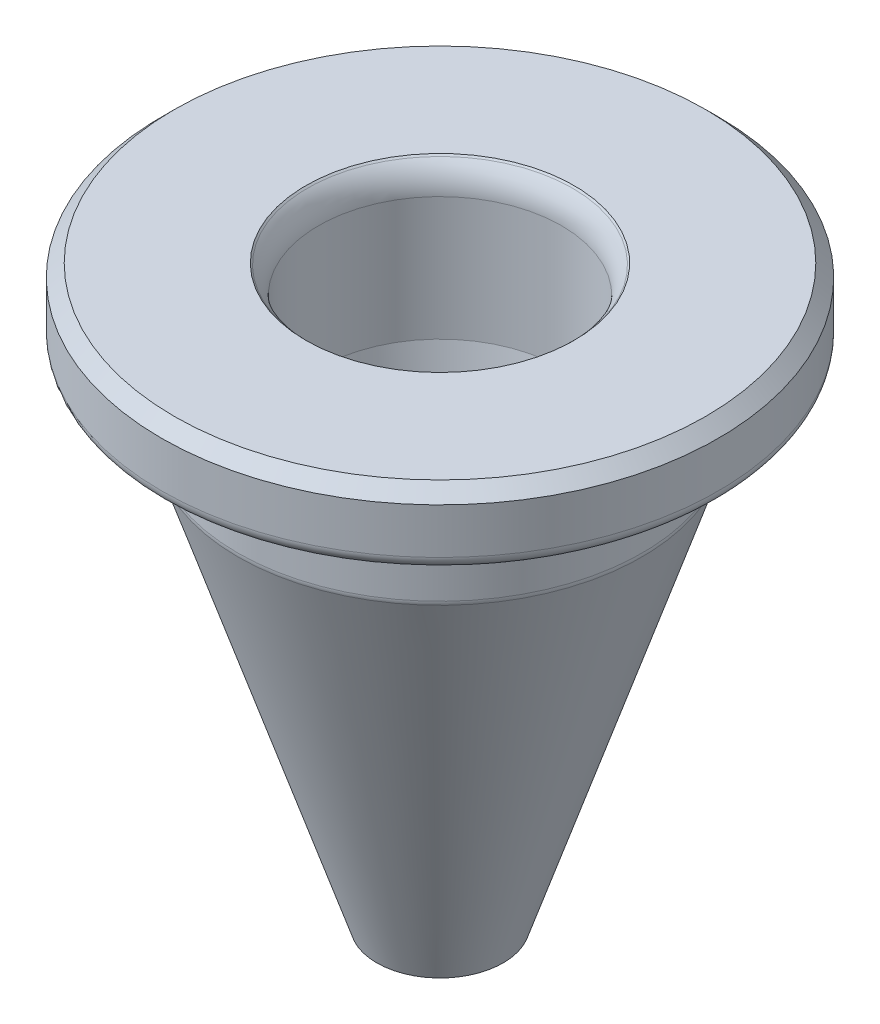
ISO-10303-21;
HEADER;
FILE_DESCRIPTION(('STEP AP214'),'2;1');
FILE_NAME('part.step','',(''),(''),'','','');
FILE_SCHEMA(('AUTOMOTIVE_DESIGN { 1 0 10303 214 1 1 1 1 }'));
ENDSEC;
DATA;
#1=APPLICATION_CONTEXT('core data for automotive mechanical design processes');
#2=APPLICATION_PROTOCOL_DEFINITION('international standard','automotive_design',2000,#1);
#3=PRODUCT_CONTEXT('',#1,'mechanical');
#4=PRODUCT('Part','Part','',(#3));
#5=PRODUCT_RELATED_PRODUCT_CATEGORY('part','',(#4));
#6=PRODUCT_DEFINITION_FORMATION('','',#4);
#7=PRODUCT_DEFINITION_CONTEXT('part definition',#1,'design');
#8=PRODUCT_DEFINITION('design','',#6,#7);
#9=PRODUCT_DEFINITION_SHAPE('','',#8);
#10=(LENGTH_UNIT() NAMED_UNIT(*) SI_UNIT(.MILLI.,.METRE.));
#11=(NAMED_UNIT(*) PLANE_ANGLE_UNIT() SI_UNIT($,.RADIAN.));
#12=(NAMED_UNIT(*) SI_UNIT($,.STERADIAN.) SOLID_ANGLE_UNIT());
#13=UNCERTAINTY_MEASURE_WITH_UNIT(LENGTH_MEASURE(1.E-05),#10,'distance_accuracy_value','');
#14=(GEOMETRIC_REPRESENTATION_CONTEXT(3) GLOBAL_UNCERTAINTY_ASSIGNED_CONTEXT((#13)) GLOBAL_UNIT_ASSIGNED_CONTEXT((#10,
#11,#12)) REPRESENTATION_CONTEXT('',''));
#15=CARTESIAN_POINT('',(0.,0.,0.));
#16=DIRECTION('',(0.,0.,1.));
#17=DIRECTION('',(1.,0.,0.));
#18=AXIS2_PLACEMENT_3D('',#15,#16,#17);
#19=CARTESIAN_POINT('',(0.,0.,0.));
#20=DIRECTION('',(0.,-1.,0.));
#21=DIRECTION('',(0.,0.,-1.));
#22=AXIS2_PLACEMENT_3D('',#19,#20,#21);
#23=CYLINDRICAL_SURFACE('',#22,8.);
#24=CARTESIAN_POINT('',(0.,19.7,0.));
#25=DIRECTION('',(0.,1.,0.));
#26=DIRECTION('',(0.,0.,1.));
#27=AXIS2_PLACEMENT_3D('',#24,#25,#26);
#28=CIRCLE('',#27,8.);
#29=CARTESIAN_POINT('',(0.,19.7,8.));
#30=VERTEX_POINT('',#29);
#31=EDGE_CURVE('E66',#30,#30,#28,.F.);
#32=ORIENTED_EDGE('',*,*,#31,.T.);
#33=EDGE_LOOP('',(#32));
#34=FACE_BOUND('',#33,.T.);
#35=CARTESIAN_POINT('',(0.,17.0802161401057,0.));
#36=DIRECTION('',(0.,1.,0.));
#37=DIRECTION('',(0.,0.,1.));
#38=AXIS2_PLACEMENT_3D('',#35,#36,#37);
#39=CIRCLE('',#38,8.);
#40=CARTESIAN_POINT('',(0.,17.0802161401057,8.));
#41=VERTEX_POINT('',#40);
#42=EDGE_CURVE('E69',#41,#41,#39,.T.);
#43=ORIENTED_EDGE('',*,*,#42,.T.);
#44=EDGE_LOOP('',(#43));
#45=FACE_BOUND('',#44,.T.);
#46=ADVANCED_FACE('F40',(#34,#45),#23,.T.);
#47=CARTESIAN_POINT('',(0.,0.,0.));
#48=DIRECTION('',(0.,1.,0.));
#49=DIRECTION('',(0.,0.,1.));
#50=AXIS2_PLACEMENT_3D('',#47,#48,#49);
#51=CONICAL_SURFACE('',#50,2.,1.03037682652431);
#52=CARTESIAN_POINT('',(0.,0.3,0.));
#53=DIRECTION('',(0.,-1.,0.));
#54=DIRECTION('',(0.,0.,-1.));
#55=AXIS2_PLACEMENT_3D('',#52,#53,#54);
#56=CIRCLE('',#55,2.5);
#57=CARTESIAN_POINT('',(0.,0.3,2.5));
#58=VERTEX_POINT('',#57);
#59=EDGE_CURVE('E87',#58,#58,#56,.T.);
#60=ORIENTED_EDGE('',*,*,#59,.T.);
#61=EDGE_LOOP('',(#60));
#62=FACE_BOUND('',#61,.T.);
#63=CARTESIAN_POINT('',(0.,0.,0.));
#64=DIRECTION('',(0.,-1.,0.));
#65=DIRECTION('',(0.,0.,-1.));
#66=AXIS2_PLACEMENT_3D('',#63,#64,#65);
#67=CIRCLE('',#66,2.);
#68=CARTESIAN_POINT('',(0.,0.,-2.));
#69=VERTEX_POINT('',#68);
#70=EDGE_CURVE('E81',#69,#69,#67,.T.);
#71=ORIENTED_EDGE('',*,*,#70,.F.);
#72=EDGE_LOOP('',(#71));
#73=FACE_BOUND('',#72,.T.);
#74=ADVANCED_FACE('F91',(#62,#73),#51,.T.);
#75=CARTESIAN_POINT('',(0.,17.,0.));
#76=DIRECTION('',(0.,1.,0.));
#77=DIRECTION('',(0.,0.,1.));
#78=AXIS2_PLACEMENT_3D('',#75,#76,#77);
#79=CONICAL_SURFACE('',#78,4.8,0.163240282784837);
#80=ORIENTED_EDGE('',*,*,#70,.T.);
#81=EDGE_LOOP('',(#80));
#82=FACE_BOUND('',#81,.T.);
#83=CARTESIAN_POINT('',(0.,17.,0.));
#84=DIRECTION('',(0.,-1.,0.));
#85=DIRECTION('',(0.,0.,-1.));
#86=AXIS2_PLACEMENT_3D('',#83,#84,#85);
#87=CIRCLE('',#86,4.8);
#88=CARTESIAN_POINT('',(0.,17.,-4.8));
#89=VERTEX_POINT('',#88);
#90=EDGE_CURVE('E84',#89,#89,#87,.T.);
#91=ORIENTED_EDGE('',*,*,#90,.F.);
#92=EDGE_LOOP('',(#91));
#93=FACE_BOUND('',#92,.T.);
#94=ADVANCED_FACE('F118',(#82,#93),#79,.F.);
#95=CARTESIAN_POINT('',(0.,0.,0.));
#96=DIRECTION('',(0.,-1.,0.));
#97=DIRECTION('',(0.,0.,-1.));
#98=AXIS2_PLACEMENT_3D('',#95,#96,#97);
#99=CYLINDRICAL_SURFACE('',#98,4.8);
#100=CARTESIAN_POINT('',(0.,21.8786796564404,0.));
#101=DIRECTION('',(0.,-1.,0.));
#102=DIRECTION('',(0.,0.,-1.));
#103=AXIS2_PLACEMENT_3D('',#100,#101,#102);
#104=CIRCLE('',#103,4.8);
#105=CARTESIAN_POINT('',(0.,21.8786796564404,-4.8));
#106=VERTEX_POINT('',#105);
#107=EDGE_CURVE('E47',#106,#106,#104,.F.);
#108=ORIENTED_EDGE('',*,*,#107,.T.);
#109=EDGE_LOOP('',(#108));
#110=FACE_BOUND('',#109,.T.);
#111=ORIENTED_EDGE('',*,*,#90,.T.);
#112=EDGE_LOOP('',(#111));
#113=FACE_BOUND('',#112,.T.);
#114=ADVANCED_FACE('F109',(#110,#113),#99,.F.);
#115=CARTESIAN_POINT('',(4.8,23.,0.));
#116=DIRECTION('',(0.,1.,0.));
#117=DIRECTION('',(0.,0.,1.));
#118=AXIS2_PLACEMENT_3D('',#115,#116,#117);
#119=PLANE('',#118);
#120=CARTESIAN_POINT('',(0.,23.,0.));
#121=DIRECTION('',(0.,1.,0.));
#122=DIRECTION('',(0.,0.,1.));
#123=AXIS2_PLACEMENT_3D('',#120,#121,#122);
#124=CIRCLE('',#123,10.5);
#125=CARTESIAN_POINT('',(0.,23.,10.5));
#126=VERTEX_POINT('',#125);
#127=EDGE_CURVE('E55',#126,#126,#124,.T.);
#128=ORIENTED_EDGE('',*,*,#127,.T.);
#129=EDGE_LOOP('',(#128));
#130=FACE_BOUND('',#129,.T.);
#131=CARTESIAN_POINT('',(0.,23.,0.));
#132=DIRECTION('',(0.,1.,0.));
#133=DIRECTION('',(0.,0.,1.));
#134=AXIS2_PLACEMENT_3D('',#131,#132,#133);
#135=CIRCLE('',#134,5.3);
#136=CARTESIAN_POINT('',(0.,23.,5.3));
#137=VERTEX_POINT('',#136);
#138=EDGE_CURVE('E60',#137,#137,#135,.F.);
#139=ORIENTED_EDGE('',*,*,#138,.T.);
#140=EDGE_LOOP('',(#139));
#141=FACE_BOUND('',#140,.T.);
#142=ADVANCED_FACE('F97',(#130,#141),#119,.T.);
#143=CARTESIAN_POINT('',(0.,0.3,0.));
#144=DIRECTION('',(0.,1.,0.));
#145=DIRECTION('',(0.,0.,1.));
#146=AXIS2_PLACEMENT_3D('',#143,#144,#145);
#147=CONICAL_SURFACE('',#146,2.5,0.318153447609098);
#148=CARTESIAN_POINT('',(0.,16.9238095339137,0.));
#149=DIRECTION('',(0.,-1.,0.));
#150=DIRECTION('',(0.,0.,-1.));
#151=AXIS2_PLACEMENT_3D('',#148,#149,#150);
#152=CIRCLE('',#151,7.97490733152847);
#153=CARTESIAN_POINT('',(0.,16.9238095339137,7.97490733152847));
#154=VERTEX_POINT('',#153);
#155=EDGE_CURVE('E63',#154,#154,#152,.T.);
#156=CARTESIAN_POINT('',(0.,16.9238095339137,7.97490733152847));
#157=CARTESIAN_POINT('',(0.,16.7506448512688,7.91787704682505));
#158=CARTESIAN_POINT('',(0.,16.5774801686239,7.86084676212163));
#159=CARTESIAN_POINT('',(0.,16.231150803334,7.74678619271479));
#160=CARTESIAN_POINT('',(0.,16.0579861206891,7.68975590801137));
#161=CARTESIAN_POINT('',(0.,15.7116567553992,7.57569533860452));
#162=CARTESIAN_POINT('',(0.,15.5384920727543,7.5186650539011));
#163=CARTESIAN_POINT('',(0.,15.1921627074644,7.40460448449426));
#164=CARTESIAN_POINT('',(0.,15.0189980248194,7.34757419979084));
#165=CARTESIAN_POINT('',(0.,14.6726686595296,7.23351363038399));
#166=CARTESIAN_POINT('',(0.,14.4995039768846,7.17648334568057));
#167=CARTESIAN_POINT('',(0.,14.1531746115948,7.06242277627373));
#168=CARTESIAN_POINT('',(0.,13.9800099289498,7.00539249157031));
#169=CARTESIAN_POINT('',(0.,13.63368056366,6.89133192216346));
#170=CARTESIAN_POINT('',(0.,13.460515881015,6.83430163746004));
#171=CARTESIAN_POINT('',(0.,13.1141865157252,6.7202410680532));
#172=CARTESIAN_POINT('',(0.,12.9410218330802,6.66321078334978));
#173=CARTESIAN_POINT('',(0.,12.5946924677904,6.54915021394293));
#174=CARTESIAN_POINT('',(0.,12.4215277851454,6.49211992923951));
#175=CARTESIAN_POINT('',(0.,12.0751984198556,6.37805935983267));
#176=CARTESIAN_POINT('',(0.,11.9020337372106,6.32102907512925));
#177=CARTESIAN_POINT('',(0.,11.5557043719208,6.2069685057224));
#178=CARTESIAN_POINT('',(0.,11.3825396892758,6.14993822101898));
#179=CARTESIAN_POINT('',(0.,11.0362103239859,6.03587765161214));
#180=CARTESIAN_POINT('',(0.,10.863045641341,5.97884736690872));
#181=CARTESIAN_POINT('',(0.,10.5167162760511,5.86478679750187));
#182=CARTESIAN_POINT('',(0.,10.3435515934062,5.80775651279845));
#183=CARTESIAN_POINT('',(0.,9.99722222811634,5.69369594339161));
#184=CARTESIAN_POINT('',(0.,9.82405754547141,5.63666565868819));
#185=CARTESIAN_POINT('',(0.,9.47772818018154,5.52260508928135));
#186=CARTESIAN_POINT('',(0.,9.3045634975366,5.46557480457792));
#187=CARTESIAN_POINT('',(0.,8.95823413224673,5.35151423517108));
#188=CARTESIAN_POINT('',(0.,8.7850694496018,5.29448395046766));
#189=CARTESIAN_POINT('',(0.,8.43874008431193,5.18042338106082));
#190=CARTESIAN_POINT('',(0.,8.26557540166699,5.1233930963574));
#191=CARTESIAN_POINT('',(0.,7.91924603637712,5.00933252695055));
#192=CARTESIAN_POINT('',(0.,7.74608135373219,4.95230224224713));
#193=CARTESIAN_POINT('',(0.,7.39975198844232,4.83824167284029));
#194=CARTESIAN_POINT('',(0.,7.22658730579739,4.78121138813686));
#195=CARTESIAN_POINT('',(0.,6.88025794050752,4.66715081873002));
#196=CARTESIAN_POINT('',(0.,6.70709325786258,4.6101205340266));
#197=CARTESIAN_POINT('',(0.,6.36076389257271,4.49605996461976));
#198=CARTESIAN_POINT('',(0.,6.18759920992778,4.43902967991634));
#199=CARTESIAN_POINT('',(0.,5.84126984463791,4.32496911050949));
#200=CARTESIAN_POINT('',(0.,5.66810516199298,4.26793882580607));
#201=CARTESIAN_POINT('',(0.,5.32177579670311,4.15387825639923));
#202=CARTESIAN_POINT('',(0.,5.14861111405817,4.09684797169581));
#203=CARTESIAN_POINT('',(0.,4.8022817487683,3.98278740228896));
#204=CARTESIAN_POINT('',(0.,4.62911706612337,3.92575711758554));
#205=CARTESIAN_POINT('',(0.,4.2827877008335,3.8116965481787));
#206=CARTESIAN_POINT('',(0.,4.10962301818856,3.75466626347528));
#207=CARTESIAN_POINT('',(0.,3.76329365289869,3.64060569406843));
#208=CARTESIAN_POINT('',(0.,3.59012897025376,3.58357540936501));
#209=CARTESIAN_POINT('',(0.,3.24379960496389,3.46951483995817));
#210=CARTESIAN_POINT('',(0.,3.07063492231895,3.41248455525475));
#211=CARTESIAN_POINT('',(0.,2.72430555702909,3.2984239858479));
#212=CARTESIAN_POINT('',(0.,2.55114087438415,3.24139370114448));
#213=CARTESIAN_POINT('',(0.,2.20481150909428,3.12733313173764));
#214=CARTESIAN_POINT('',(0.,2.03164682644935,3.07030284703422));
#215=CARTESIAN_POINT('',(0.,1.68531746115948,2.95624227762737));
#216=CARTESIAN_POINT('',(0.,1.51215277851454,2.89921199292395));
#217=CARTESIAN_POINT('',(0.,1.16582341322467,2.78515142351711));
#218=CARTESIAN_POINT('',(0.,0.992658730579739,2.72812113881369));
#219=CARTESIAN_POINT('',(0.,0.646329365289869,2.61406056940684));
#220=CARTESIAN_POINT('',(0.,0.473164682644935,2.55703028470342));
#221=CARTESIAN_POINT('',(0.,0.3,2.5));
#222=B_SPLINE_CURVE_WITH_KNOTS('',3,(#156,#157,#158,#159,#160,#161,#162,#163,#164,#165,#166,
#167,#168,#169,#170,#171,#172,#173,#174,#175,#176,#177,#178,#179,#180,#181,#182,#183,#184,#185,
#186,#187,#188,#189,#190,#191,#192,#193,#194,#195,#196,#197,#198,#199,#200,#201,#202,#203,#204,
#205,#206,#207,#208,#209,#210,#211,#212,#213,#214,#215,#216,#217,#218,#219,#220,#221),
.UNSPECIFIED.,.F.,.F.,(4,2,2,2,2,2,2,2,2,2,2,2,2,2,2,2,2,2,2,2,2,2,2,2,2,2,2,2,2,2,2,2,4),(0.,
0.546942543783046,1.09388508756609,1.64082763134914,2.18777017513218,2.73471271891523,
3.28165526269827,3.82859780648132,4.37554035026436,4.92248289404741,5.46942543783045,
6.0163679816135,6.56331052539654,7.11025306917959,7.65719561296264,8.20413815674568,
8.75108070052873,9.29802324431177,9.84496578809482,10.3919083318779,10.9388508756609,
11.485793419444,12.032735963227,12.57967850701,13.1266210507931,13.6735635945761,
14.2205061383592,14.7674486821422,15.3143912259253,15.8613337697083,16.4082763134914,
16.9552188572744,17.5021614010574),.UNSPECIFIED.);
#223=EDGE_CURVE('BSEAM94',#154,#58,#222,.T.);
#224=ORIENTED_EDGE('',*,*,#155,.T.);
#225=ORIENTED_EDGE('',*,*,#59,.F.);
#226=ORIENTED_EDGE('',*,*,#223,.T.);
#227=ORIENTED_EDGE('',*,*,#223,.F.);
#228=EDGE_LOOP('',(#224,#226,#225,#227));
#229=FACE_BOUND('',#228,.T.);
#230=ADVANCED_FACE('F94',(#229),#147,.T.);
#231=CARTESIAN_POINT('',(0.,20.2,0.));
#232=DIRECTION('',(0.,1.,0.));
#233=DIRECTION('',(0.,0.,1.));
#234=AXIS2_PLACEMENT_3D('',#231,#232,#233);
#235=CYLINDRICAL_SURFACE('',#234,11.);
#236=CARTESIAN_POINT('',(0.,22.5,0.));
#237=DIRECTION('',(0.,1.,0.));
#238=DIRECTION('',(0.,0.,1.));
#239=AXIS2_PLACEMENT_3D('',#236,#237,#238);
#240=CIRCLE('',#239,11.);
#241=CARTESIAN_POINT('',(0.,22.5,11.));
#242=VERTEX_POINT('',#241);
#243=EDGE_CURVE('E51',#242,#242,#240,.F.);
#244=ORIENTED_EDGE('',*,*,#243,.T.);
#245=EDGE_LOOP('',(#244));
#246=FACE_BOUND('',#245,.T.);
#247=CARTESIAN_POINT('',(0.,20.7,0.));
#248=DIRECTION('',(0.,1.,0.));
#249=DIRECTION('',(0.,0.,1.));
#250=AXIS2_PLACEMENT_3D('',#247,#248,#249);
#251=CIRCLE('',#250,11.);
#252=CARTESIAN_POINT('',(0.,20.7,11.));
#253=VERTEX_POINT('',#252);
#254=EDGE_CURVE('E78',#253,#253,#251,.T.);
#255=ORIENTED_EDGE('',*,*,#254,.T.);
#256=EDGE_LOOP('',(#255));
#257=FACE_BOUND('',#256,.T.);
#258=ADVANCED_FACE('F96',(#246,#257),#235,.T.);
#259=CARTESIAN_POINT('',(0.,20.2,0.));
#260=DIRECTION('',(0.,1.,0.));
#261=DIRECTION('',(0.,0.,1.));
#262=AXIS2_PLACEMENT_3D('',#259,#260,#261);
#263=PLANE('',#262);
#264=CARTESIAN_POINT('',(0.,20.2,0.));
#265=DIRECTION('',(0.,1.,0.));
#266=DIRECTION('',(0.,0.,1.));
#267=AXIS2_PLACEMENT_3D('',#264,#265,#266);
#268=CIRCLE('',#267,10.5);
#269=CARTESIAN_POINT('',(0.,20.2,10.5));
#270=VERTEX_POINT('',#269);
#271=EDGE_CURVE('E72',#270,#270,#268,.F.);
#272=ORIENTED_EDGE('',*,*,#271,.T.);
#273=EDGE_LOOP('',(#272));
#274=FACE_BOUND('',#273,.T.);
#275=CARTESIAN_POINT('',(0.,20.2,0.));
#276=DIRECTION('',(0.,1.,0.));
#277=DIRECTION('',(0.,0.,1.));
#278=AXIS2_PLACEMENT_3D('',#275,#276,#277);
#279=CIRCLE('',#278,8.5);
#280=CARTESIAN_POINT('',(0.,20.2,8.5));
#281=VERTEX_POINT('',#280);
#282=EDGE_CURVE('E75',#281,#281,#279,.T.);
#283=ORIENTED_EDGE('',*,*,#282,.T.);
#284=EDGE_LOOP('',(#283));
#285=FACE_BOUND('',#284,.T.);
#286=ADVANCED_FACE('F105',(#274,#285),#263,.F.);
#287=CARTESIAN_POINT('',(0.,20.7,0.));
#288=DIRECTION('',(0.,1.,0.));
#289=DIRECTION('',(0.,0.,1.));
#290=AXIS2_PLACEMENT_3D('',#287,#288,#289);
#291=TOROIDAL_SURFACE('',#290,10.5,0.5);
#292=ORIENTED_EDGE('',*,*,#271,.F.);
#293=EDGE_LOOP('',(#292));
#294=FACE_BOUND('',#293,.T.);
#295=ORIENTED_EDGE('',*,*,#254,.F.);
#296=EDGE_LOOP('',(#295));
#297=FACE_BOUND('',#296,.T.);
#298=ADVANCED_FACE('F126',(#294,#297),#291,.T.);
#299=CARTESIAN_POINT('',(0.,19.7,0.));
#300=DIRECTION('',(0.,1.,0.));
#301=DIRECTION('',(0.,0.,1.));
#302=AXIS2_PLACEMENT_3D('',#299,#300,#301);
#303=TOROIDAL_SURFACE('',#302,8.5,0.5);
#304=ORIENTED_EDGE('',*,*,#282,.F.);
#305=EDGE_LOOP('',(#304));
#306=FACE_BOUND('',#305,.T.);
#307=ORIENTED_EDGE('',*,*,#31,.F.);
#308=EDGE_LOOP('',(#307));
#309=FACE_BOUND('',#308,.T.);
#310=ADVANCED_FACE('F129',(#306,#309),#303,.F.);
#311=CARTESIAN_POINT('',(0.,17.0802161401057,0.));
#312=DIRECTION('',(0.,1.,0.));
#313=DIRECTION('',(0.,0.,1.));
#314=AXIS2_PLACEMENT_3D('',#311,#312,#313);
#315=TOROIDAL_SURFACE('',#314,7.5,0.5);
#316=ORIENTED_EDGE('',*,*,#42,.F.);
#317=EDGE_LOOP('',(#316));
#318=FACE_BOUND('',#317,.T.);
#319=ORIENTED_EDGE('',*,*,#155,.F.);
#320=EDGE_LOOP('',(#319));
#321=FACE_BOUND('',#320,.T.);
#322=ADVANCED_FACE('F133',(#318,#321),#315,.T.);
#323=CARTESIAN_POINT('',(0.,23.,0.));
#324=DIRECTION('',(0.,-1.,0.));
#325=DIRECTION('',(0.,0.,-1.));
#326=AXIS2_PLACEMENT_3D('',#323,#324,#325);
#327=CONICAL_SURFACE('',#326,10.5,0.785398163397452);
#328=ORIENTED_EDGE('',*,*,#243,.F.);
#329=EDGE_LOOP('',(#328));
#330=FACE_BOUND('',#329,.T.);
#331=ORIENTED_EDGE('',*,*,#127,.F.);
#332=EDGE_LOOP('',(#331));
#333=FACE_BOUND('',#332,.T.);
#334=ADVANCED_FACE('F137',(#330,#333),#327,.T.);
#335=CARTESIAN_POINT('',(0.,23.,0.));
#336=DIRECTION('',(0.,1.,0.));
#337=DIRECTION('',(0.,0.,1.));
#338=AXIS2_PLACEMENT_3D('',#335,#336,#337);
#339=CONICAL_SURFACE('',#338,5.3,0.785398163397448);
#340=CARTESIAN_POINT('',(0.,22.9393398282202,0.));
#341=DIRECTION('',(0.,-1.,0.));
#342=DIRECTION('',(0.,0.,-1.));
#343=AXIS2_PLACEMENT_3D('',#340,#341,#342);
#344=CIRCLE('',#343,5.23933982822018);
#345=CARTESIAN_POINT('',(0.,22.9393398282202,-5.23933982822018));
#346=VERTEX_POINT('',#345);
#347=EDGE_CURVE('E11',#346,#346,#344,.T.);
#348=ORIENTED_EDGE('',*,*,#347,.T.);
#349=EDGE_LOOP('',(#348));
#350=FACE_BOUND('',#349,.T.);
#351=ORIENTED_EDGE('',*,*,#138,.F.);
#352=EDGE_LOOP('',(#351));
#353=FACE_BOUND('',#352,.T.);
#354=ADVANCED_FACE('F144',(#350,#353),#339,.F.);
#355=CARTESIAN_POINT('',(0.,21.8786796564404,0.));
#356=DIRECTION('',(0.,-1.,0.));
#357=DIRECTION('',(0.,0.,-1.));
#358=AXIS2_PLACEMENT_3D('',#355,#356,#357);
#359=TOROIDAL_SURFACE('',#358,6.3,1.5);
#360=ORIENTED_EDGE('',*,*,#347,.F.);
#361=EDGE_LOOP('',(#360));
#362=FACE_BOUND('',#361,.T.);
#363=ORIENTED_EDGE('',*,*,#107,.F.);
#364=EDGE_LOOP('',(#363));
#365=FACE_BOUND('',#364,.T.);
#366=ADVANCED_FACE('F42',(#362,#365),#359,.T.);
#367=CLOSED_SHELL('',(#46,#74,#94,#114,#142,#230,#258,#286,#298,#310,#322,#334,#354,#366));
#368=MANIFOLD_SOLID_BREP('B2',#367);
#369=ADVANCED_BREP_SHAPE_REPRESENTATION('',(#18,#368),#14);
#370=SHAPE_DEFINITION_REPRESENTATION(#9,#369);
ENDSEC;
END-ISO-10303-21;
